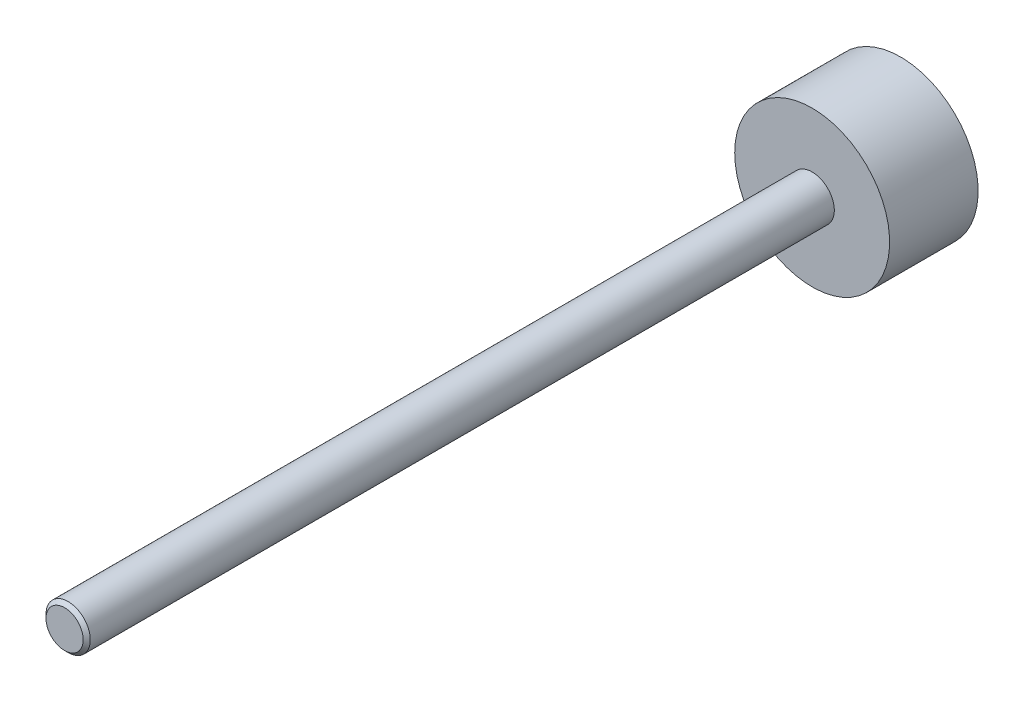
ISO-10303-21;
HEADER;
FILE_DESCRIPTION(('STEP AP214'),'2;1');
FILE_NAME('part.step','',(''),(''),'','','');
FILE_SCHEMA(('AUTOMOTIVE_DESIGN { 1 0 10303 214 1 1 1 1 }'));
ENDSEC;
DATA;
#1=APPLICATION_CONTEXT('core data for automotive mechanical design processes');
#2=APPLICATION_PROTOCOL_DEFINITION('international standard','automotive_design',2000,#1);
#3=PRODUCT_CONTEXT('',#1,'mechanical');
#4=PRODUCT('Part','Part','',(#3));
#5=PRODUCT_RELATED_PRODUCT_CATEGORY('part','',(#4));
#6=PRODUCT_DEFINITION_FORMATION('','',#4);
#7=PRODUCT_DEFINITION_CONTEXT('part definition',#1,'design');
#8=PRODUCT_DEFINITION('design','',#6,#7);
#9=PRODUCT_DEFINITION_SHAPE('','',#8);
#10=(LENGTH_UNIT() NAMED_UNIT(*) SI_UNIT(.MILLI.,.METRE.));
#11=(NAMED_UNIT(*) PLANE_ANGLE_UNIT() SI_UNIT($,.RADIAN.));
#12=(NAMED_UNIT(*) SI_UNIT($,.STERADIAN.) SOLID_ANGLE_UNIT());
#13=UNCERTAINTY_MEASURE_WITH_UNIT(LENGTH_MEASURE(1.E-05),#10,'distance_accuracy_value','');
#14=(GEOMETRIC_REPRESENTATION_CONTEXT(3) GLOBAL_UNCERTAINTY_ASSIGNED_CONTEXT((#13)) GLOBAL_UNIT_ASSIGNED_CONTEXT((#10,
#11,#12)) REPRESENTATION_CONTEXT('',''));
#15=CARTESIAN_POINT('',(0.,0.,0.));
#16=DIRECTION('',(0.,0.,1.));
#17=DIRECTION('',(1.,0.,0.));
#18=AXIS2_PLACEMENT_3D('',#15,#16,#17);
#19=CARTESIAN_POINT('',(0.,0.,-270.657842594445));
#20=DIRECTION('',(0.,0.,1.));
#21=DIRECTION('',(1.,0.,0.));
#22=AXIS2_PLACEMENT_3D('',#19,#20,#21);
#23=PLANE('',#22);
#24=CARTESIAN_POINT('',(0.,0.,-270.657842594445));
#25=DIRECTION('',(0.,0.,-1.));
#26=DIRECTION('',(-1.,0.,0.));
#27=AXIS2_PLACEMENT_3D('',#24,#25,#26);
#28=CIRCLE('',#27,11.1125);
#29=CARTESIAN_POINT('',(-11.1125,0.,-270.657842594445));
#30=VERTEX_POINT('',#29);
#31=EDGE_CURVE('E17',#30,#30,#28,.F.);
#32=ORIENTED_EDGE('',*,*,#31,.F.);
#33=EDGE_LOOP('',(#32));
#34=FACE_BOUND('',#33,.T.);
#35=ADVANCED_FACE('F14',(#34),#23,.F.);
#36=CARTESIAN_POINT('',(0.,0.,-150.706342594445));
#37=DIRECTION('',(0.,0.,1.));
#38=DIRECTION('',(1.,0.,0.));
#39=AXIS2_PLACEMENT_3D('',#36,#37,#38);
#40=PLANE('',#39);
#41=CARTESIAN_POINT('',(0.,0.,-150.706342594447));
#42=DIRECTION('',(0.,0.,-1.));
#43=DIRECTION('',(-1.,0.,0.));
#44=AXIS2_PLACEMENT_3D('',#41,#42,#43);
#45=CIRCLE('',#44,2.66699999991715);
#46=CARTESIAN_POINT('',(-2.66699999991715,0.,-150.706342594447));
#47=VERTEX_POINT('',#46);
#48=EDGE_CURVE('E30',#47,#47,#45,.T.);
#49=ORIENTED_EDGE('',*,*,#48,.F.);
#50=EDGE_LOOP('',(#49));
#51=FACE_BOUND('',#50,.T.);
#52=ADVANCED_FACE('F41',(#51),#40,.T.);
#53=CARTESIAN_POINT('',(0.,0.,-257.957842594445));
#54=DIRECTION('',(0.,0.,-1.));
#55=DIRECTION('',(-1.,0.,0.));
#56=AXIS2_PLACEMENT_3D('',#53,#54,#55);
#57=CYLINDRICAL_SURFACE('',#56,11.1125);
#58=ORIENTED_EDGE('',*,*,#31,.T.);
#59=EDGE_LOOP('',(#58));
#60=FACE_BOUND('',#59,.T.);
#61=CARTESIAN_POINT('',(0.,0.,-257.957842594445));
#62=DIRECTION('',(0.,0.,-1.));
#63=DIRECTION('',(-1.,0.,0.));
#64=AXIS2_PLACEMENT_3D('',#61,#62,#63);
#65=CIRCLE('',#64,11.1125);
#66=CARTESIAN_POINT('',(-11.1125,0.,-257.957842594445));
#67=VERTEX_POINT('',#66);
#68=EDGE_CURVE('E26',#67,#67,#65,.F.);
#69=ORIENTED_EDGE('',*,*,#68,.F.);
#70=EDGE_LOOP('',(#69));
#71=FACE_BOUND('',#70,.T.);
#72=ADVANCED_FACE('F37',(#60,#71),#57,.T.);
#73=CARTESIAN_POINT('',(0.,0.,-151.214342594471));
#74=DIRECTION('',(0.,0.,-1.));
#75=DIRECTION('',(-1.,0.,0.));
#76=AXIS2_PLACEMENT_3D('',#73,#74,#75);
#77=CONICAL_SURFACE('',#76,3.17499999999882,0.785398163453397);
#78=CARTESIAN_POINT('',(0.,0.,-151.214342594445));
#79=DIRECTION('',(0.,0.,-1.));
#80=DIRECTION('',(-1.,0.,0.));
#81=AXIS2_PLACEMENT_3D('',#78,#79,#80);
#82=CIRCLE('',#81,3.175);
#83=CARTESIAN_POINT('',(-3.175,0.,-151.214342594445));
#84=VERTEX_POINT('',#83);
#85=EDGE_CURVE('E21',#84,#84,#82,.T.);
#86=ORIENTED_EDGE('',*,*,#85,.F.);
#87=EDGE_LOOP('',(#86));
#88=FACE_BOUND('',#87,.T.);
#89=ORIENTED_EDGE('',*,*,#48,.T.);
#90=EDGE_LOOP('',(#89));
#91=FACE_BOUND('',#90,.T.);
#92=ADVANCED_FACE('F54',(#88,#91),#77,.T.);
#93=CARTESIAN_POINT('',(0.,0.,-257.957842594445));
#94=DIRECTION('',(0.,0.,1.));
#95=DIRECTION('',(1.,0.,0.));
#96=AXIS2_PLACEMENT_3D('',#93,#94,#95);
#97=PLANE('',#96);
#98=CARTESIAN_POINT('',(0.,0.,-257.957842594445));
#99=DIRECTION('',(0.,0.,-1.));
#100=DIRECTION('',(-1.,0.,0.));
#101=AXIS2_PLACEMENT_3D('',#98,#99,#100);
#102=CIRCLE('',#101,3.175);
#103=CARTESIAN_POINT('',(-3.175,0.,-257.957842594445));
#104=VERTEX_POINT('',#103);
#105=EDGE_CURVE('E10',#104,#104,#102,.F.);
#106=ORIENTED_EDGE('',*,*,#105,.F.);
#107=EDGE_LOOP('',(#106));
#108=FACE_BOUND('',#107,.T.);
#109=ORIENTED_EDGE('',*,*,#68,.T.);
#110=EDGE_LOOP('',(#109));
#111=FACE_BOUND('',#110,.T.);
#112=ADVANCED_FACE('F49',(#108,#111),#97,.T.);
#113=CARTESIAN_POINT('',(0.,0.,-141.726086473376));
#114=DIRECTION('',(0.,0.,-1.));
#115=DIRECTION('',(-1.,0.,0.));
#116=AXIS2_PLACEMENT_3D('',#113,#114,#115);
#117=CYLINDRICAL_SURFACE('',#116,3.175);
#118=ORIENTED_EDGE('',*,*,#105,.T.);
#119=EDGE_LOOP('',(#118));
#120=FACE_BOUND('',#119,.T.);
#121=ORIENTED_EDGE('',*,*,#85,.T.);
#122=EDGE_LOOP('',(#121));
#123=FACE_BOUND('',#122,.T.);
#124=ADVANCED_FACE('F47',(#120,#123),#117,.T.);
#125=CLOSED_SHELL('',(#35,#52,#72,#92,#112,#124));
#126=MANIFOLD_SOLID_BREP('B1',#125);
#127=ADVANCED_BREP_SHAPE_REPRESENTATION('',(#18,#126),#14);
#128=SHAPE_DEFINITION_REPRESENTATION(#9,#127);
ENDSEC;
END-ISO-10303-21;
